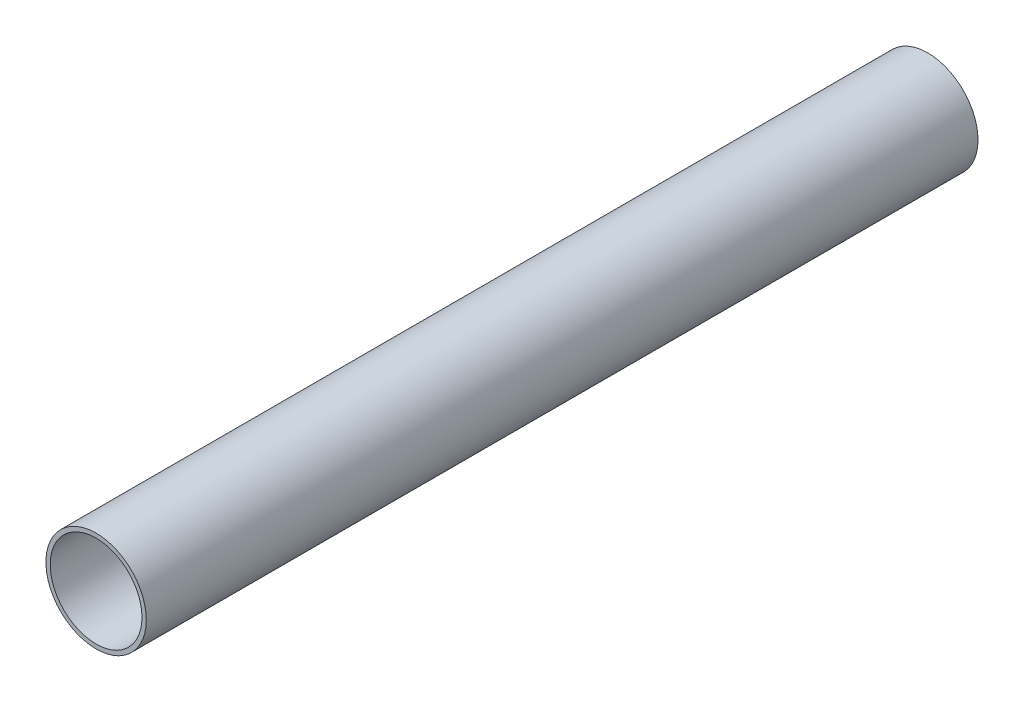
ISO-10303-21;
HEADER;
FILE_DESCRIPTION(('STEP AP214'),'2;1');
FILE_NAME('part.step','',(''),(''),'','','');
FILE_SCHEMA(('AUTOMOTIVE_DESIGN { 1 0 10303 214 1 1 1 1 }'));
ENDSEC;
DATA;
#1=APPLICATION_CONTEXT('core data for automotive mechanical design processes');
#2=APPLICATION_PROTOCOL_DEFINITION('international standard','automotive_design',2000,#1);
#3=PRODUCT_CONTEXT('',#1,'mechanical');
#4=PRODUCT('Part','Part','',(#3));
#5=PRODUCT_RELATED_PRODUCT_CATEGORY('part','',(#4));
#6=PRODUCT_DEFINITION_FORMATION('','',#4);
#7=PRODUCT_DEFINITION_CONTEXT('part definition',#1,'design');
#8=PRODUCT_DEFINITION('design','',#6,#7);
#9=PRODUCT_DEFINITION_SHAPE('','',#8);
#10=(LENGTH_UNIT() NAMED_UNIT(*) SI_UNIT(.MILLI.,.METRE.));
#11=(NAMED_UNIT(*) PLANE_ANGLE_UNIT() SI_UNIT($,.RADIAN.));
#12=(NAMED_UNIT(*) SI_UNIT($,.STERADIAN.) SOLID_ANGLE_UNIT());
#13=UNCERTAINTY_MEASURE_WITH_UNIT(LENGTH_MEASURE(1.E-05),#10,'distance_accuracy_value','');
#14=(GEOMETRIC_REPRESENTATION_CONTEXT(3) GLOBAL_UNCERTAINTY_ASSIGNED_CONTEXT((#13)) GLOBAL_UNIT_ASSIGNED_CONTEXT((#10,
#11,#12)) REPRESENTATION_CONTEXT('',''));
#15=CARTESIAN_POINT('',(0.,0.,0.));
#16=DIRECTION('',(0.,0.,1.));
#17=DIRECTION('',(1.,0.,0.));
#18=AXIS2_PLACEMENT_3D('',#15,#16,#17);
#19=CARTESIAN_POINT('',(0.,0.,290.));
#20=DIRECTION('',(0.,0.,1.));
#21=DIRECTION('',(1.,0.,0.));
#22=AXIS2_PLACEMENT_3D('',#19,#20,#21);
#23=PLANE('',#22);
#24=CARTESIAN_POINT('',(0.,0.,290.));
#25=DIRECTION('',(0.,0.,1.));
#26=DIRECTION('',(1.,0.,0.));
#27=AXIS2_PLACEMENT_3D('',#24,#25,#26);
#28=CIRCLE('',#27,17.5);
#29=CARTESIAN_POINT('',(17.5,0.,290.));
#30=VERTEX_POINT('',#29);
#31=EDGE_CURVE('E10',#30,#30,#28,.T.);
#32=ORIENTED_EDGE('',*,*,#31,.T.);
#33=EDGE_LOOP('',(#32));
#34=FACE_BOUND('',#33,.T.);
#35=CARTESIAN_POINT('',(0.,0.,290.));
#36=DIRECTION('',(0.,0.,1.));
#37=DIRECTION('',(1.,0.,0.));
#38=AXIS2_PLACEMENT_3D('',#35,#36,#37);
#39=CIRCLE('',#38,16.);
#40=CARTESIAN_POINT('',(16.,0.,290.));
#41=VERTEX_POINT('',#40);
#42=EDGE_CURVE('E42',#41,#41,#39,.T.);
#43=ORIENTED_EDGE('',*,*,#42,.F.);
#44=EDGE_LOOP('',(#43));
#45=FACE_BOUND('',#44,.T.);
#46=ADVANCED_FACE('F31',(#34,#45),#23,.T.);
#47=CARTESIAN_POINT('',(0.,0.,0.));
#48=DIRECTION('',(0.,0.,1.));
#49=DIRECTION('',(1.,0.,0.));
#50=AXIS2_PLACEMENT_3D('',#47,#48,#49);
#51=PLANE('',#50);
#52=CARTESIAN_POINT('',(0.,0.,0.));
#53=DIRECTION('',(0.,0.,1.));
#54=DIRECTION('',(1.,0.,0.));
#55=AXIS2_PLACEMENT_3D('',#52,#53,#54);
#56=CIRCLE('',#55,17.5);
#57=CARTESIAN_POINT('',(17.5,0.,0.));
#58=VERTEX_POINT('',#57);
#59=EDGE_CURVE('E35',#58,#58,#56,.T.);
#60=ORIENTED_EDGE('',*,*,#59,.F.);
#61=EDGE_LOOP('',(#60));
#62=FACE_BOUND('',#61,.T.);
#63=CARTESIAN_POINT('',(0.,0.,0.));
#64=DIRECTION('',(0.,0.,1.));
#65=DIRECTION('',(1.,0.,0.));
#66=AXIS2_PLACEMENT_3D('',#63,#64,#65);
#67=CIRCLE('',#66,16.);
#68=CARTESIAN_POINT('',(16.,0.,0.));
#69=VERTEX_POINT('',#68);
#70=EDGE_CURVE('E44',#69,#69,#67,.T.);
#71=ORIENTED_EDGE('',*,*,#70,.T.);
#72=EDGE_LOOP('',(#71));
#73=FACE_BOUND('',#72,.T.);
#74=ADVANCED_FACE('F54',(#62,#73),#51,.F.);
#75=CARTESIAN_POINT('',(0.,0.,290.));
#76=DIRECTION('',(0.,0.,-1.));
#77=DIRECTION('',(-1.,0.,0.));
#78=AXIS2_PLACEMENT_3D('',#75,#76,#77);
#79=CYLINDRICAL_SURFACE('',#78,17.5);
#80=ORIENTED_EDGE('',*,*,#31,.F.);
#81=EDGE_LOOP('',(#80));
#82=FACE_BOUND('',#81,.T.);
#83=ORIENTED_EDGE('',*,*,#59,.T.);
#84=EDGE_LOOP('',(#83));
#85=FACE_BOUND('',#84,.T.);
#86=ADVANCED_FACE('F33',(#82,#85),#79,.T.);
#87=CARTESIAN_POINT('',(0.,0.,290.));
#88=DIRECTION('',(0.,0.,-1.));
#89=DIRECTION('',(-1.,0.,0.));
#90=AXIS2_PLACEMENT_3D('',#87,#88,#89);
#91=CYLINDRICAL_SURFACE('',#90,16.);
#92=ORIENTED_EDGE('',*,*,#42,.T.);
#93=EDGE_LOOP('',(#92));
#94=FACE_BOUND('',#93,.T.);
#95=ORIENTED_EDGE('',*,*,#70,.F.);
#96=EDGE_LOOP('',(#95));
#97=FACE_BOUND('',#96,.T.);
#98=ADVANCED_FACE('F50',(#94,#97),#91,.F.);
#99=CLOSED_SHELL('',(#46,#74,#86,#98));
#100=MANIFOLD_SOLID_BREP('B2',#99);
#101=ADVANCED_BREP_SHAPE_REPRESENTATION('',(#18,#100),#14);
#102=SHAPE_DEFINITION_REPRESENTATION(#9,#101);
ENDSEC;
END-ISO-10303-21;
